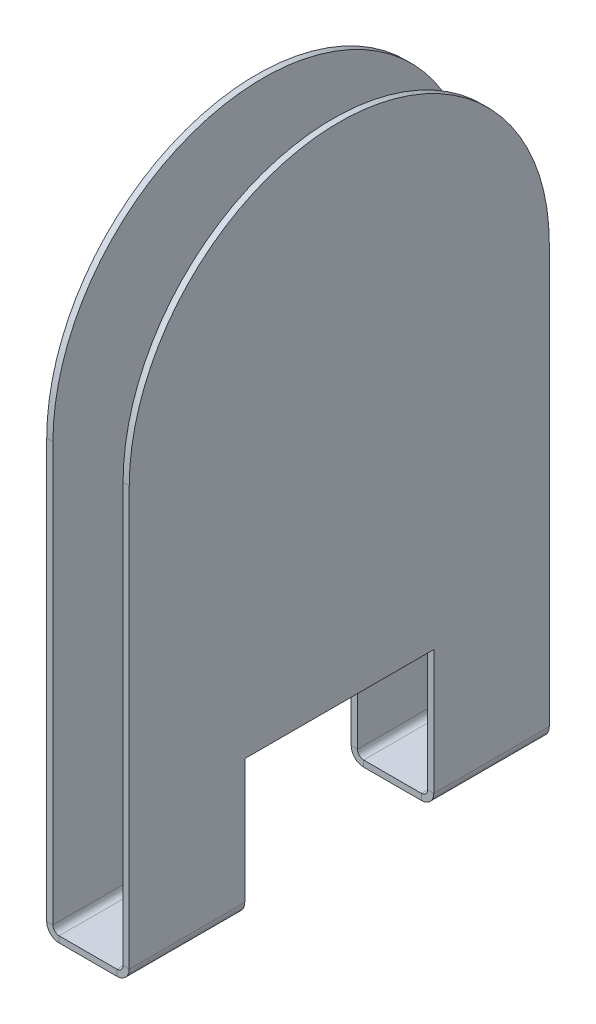
ISO-10303-21;
HEADER;
FILE_DESCRIPTION(('STEP AP214'),'2;1');
FILE_NAME('part.step','',(''),(''),'','','');
FILE_SCHEMA(('AUTOMOTIVE_DESIGN { 1 0 10303 214 1 1 1 1 }'));
ENDSEC;
DATA;
#1=APPLICATION_CONTEXT('core data for automotive mechanical design processes');
#2=APPLICATION_PROTOCOL_DEFINITION('international standard','automotive_design',2000,#1);
#3=PRODUCT_CONTEXT('',#1,'mechanical');
#4=PRODUCT('Part','Part','',(#3));
#5=PRODUCT_RELATED_PRODUCT_CATEGORY('part','',(#4));
#6=PRODUCT_DEFINITION_FORMATION('','',#4);
#7=PRODUCT_DEFINITION_CONTEXT('part definition',#1,'design');
#8=PRODUCT_DEFINITION('design','',#6,#7);
#9=PRODUCT_DEFINITION_SHAPE('','',#8);
#10=(LENGTH_UNIT() NAMED_UNIT(*) SI_UNIT(.MILLI.,.METRE.));
#11=(NAMED_UNIT(*) PLANE_ANGLE_UNIT() SI_UNIT($,.RADIAN.));
#12=(NAMED_UNIT(*) SI_UNIT($,.STERADIAN.) SOLID_ANGLE_UNIT());
#13=UNCERTAINTY_MEASURE_WITH_UNIT(LENGTH_MEASURE(1.E-05),#10,'distance_accuracy_value','');
#14=(GEOMETRIC_REPRESENTATION_CONTEXT(3) GLOBAL_UNCERTAINTY_ASSIGNED_CONTEXT((#13)) GLOBAL_UNIT_ASSIGNED_CONTEXT((#10,
#11,#12)) REPRESENTATION_CONTEXT('',''));
#15=CARTESIAN_POINT('',(0.,0.,0.));
#16=DIRECTION('',(0.,0.,1.));
#17=DIRECTION('',(1.,0.,0.));
#18=AXIS2_PLACEMENT_3D('',#15,#16,#17);
#19=CARTESIAN_POINT('',(35.,-0.7366,11.25));
#20=DIRECTION('',(0.,0.,1.));
#21=DIRECTION('',(1.,0.,0.));
#22=AXIS2_PLACEMENT_3D('',#19,#20,#21);
#23=PLANE('',#22);
#24=DIRECTION('',(1.,0.,0.));
#25=VECTOR('',#24,1.);
#26=CARTESIAN_POINT('',(35.,0.,11.25));
#27=LINE('',#26,#25);
#28=CARTESIAN_POINT('',(51.5616,0.,11.25));
#29=VERTEX_POINT('',#28);
#30=CARTESIAN_POINT('',(58.4384,0.,11.25));
#31=VERTEX_POINT('',#30);
#32=EDGE_CURVE('E68',#29,#31,#27,.T.);
#33=ORIENTED_EDGE('',*,*,#32,.T.);
#34=DIRECTION('',(0.,-1.,0.));
#35=VECTOR('',#34,1.);
#36=CARTESIAN_POINT('',(58.4384,-0.7366,11.25));
#37=LINE('',#36,#35);
#38=CARTESIAN_POINT('',(58.4384,-0.7366,11.25));
#39=VERTEX_POINT('',#38);
#40=EDGE_CURVE('E423',#31,#39,#37,.T.);
#41=ORIENTED_EDGE('',*,*,#40,.T.);
#42=DIRECTION('',(1.,0.,0.));
#43=VECTOR('',#42,1.);
#44=CARTESIAN_POINT('',(35.,-0.7366,11.25));
#45=LINE('',#44,#43);
#46=CARTESIAN_POINT('',(51.5616,-0.7366,11.25));
#47=VERTEX_POINT('',#46);
#48=EDGE_CURVE('E47',#47,#39,#45,.T.);
#49=ORIENTED_EDGE('',*,*,#48,.F.);
#50=DIRECTION('',(0.,-1.,0.));
#51=VECTOR('',#50,1.);
#52=CARTESIAN_POINT('',(51.5616,-0.7366,11.25));
#53=LINE('',#52,#51);
#54=EDGE_CURVE('E407',#29,#47,#53,.T.);
#55=ORIENTED_EDGE('',*,*,#54,.F.);
#56=EDGE_LOOP('',(#33,#41,#49,#55));
#57=FACE_BOUND('',#56,.T.);
#58=ADVANCED_FACE('F43',(#57),#23,.F.);
#59=CARTESIAN_POINT('',(35.,-0.7366,-11.25));
#60=DIRECTION('',(0.,0.,-1.));
#61=DIRECTION('',(-1.,0.,0.));
#62=AXIS2_PLACEMENT_3D('',#59,#60,#61);
#63=PLANE('',#62);
#64=DIRECTION('',(-1.,0.,0.));
#65=VECTOR('',#64,1.);
#66=CARTESIAN_POINT('',(35.,-0.7366,-11.25));
#67=LINE('',#66,#65);
#68=CARTESIAN_POINT('',(58.4384,-0.7366,-11.25));
#69=VERTEX_POINT('',#68);
#70=CARTESIAN_POINT('',(51.5616,-0.7366,-11.25));
#71=VERTEX_POINT('',#70);
#72=EDGE_CURVE('E436',#69,#71,#67,.T.);
#73=ORIENTED_EDGE('',*,*,#72,.F.);
#74=DIRECTION('',(0.,1.,0.));
#75=VECTOR('',#74,1.);
#76=CARTESIAN_POINT('',(58.4384,-0.7366,-11.25));
#77=LINE('',#76,#75);
#78=CARTESIAN_POINT('',(58.4384,0.,-11.25));
#79=VERTEX_POINT('',#78);
#80=EDGE_CURVE('E417',#69,#79,#77,.T.);
#81=ORIENTED_EDGE('',*,*,#80,.T.);
#82=DIRECTION('',(-1.,0.,0.));
#83=VECTOR('',#82,1.);
#84=CARTESIAN_POINT('',(35.,0.,-11.25));
#85=LINE('',#84,#83);
#86=CARTESIAN_POINT('',(51.5616,0.,-11.25));
#87=VERTEX_POINT('',#86);
#88=EDGE_CURVE('E427',#79,#87,#85,.T.);
#89=ORIENTED_EDGE('',*,*,#88,.T.);
#90=DIRECTION('',(0.,1.,0.));
#91=VECTOR('',#90,1.);
#92=CARTESIAN_POINT('',(51.5616,-0.7366,-11.25));
#93=LINE('',#92,#91);
#94=EDGE_CURVE('E390',#71,#87,#93,.T.);
#95=ORIENTED_EDGE('',*,*,#94,.F.);
#96=EDGE_LOOP('',(#73,#81,#89,#95));
#97=FACE_BOUND('',#96,.T.);
#98=ADVANCED_FACE('F45',(#97),#63,.F.);
#99=CARTESIAN_POINT('',(0.,-0.7366,0.));
#100=DIRECTION('',(0.,1.,0.));
#101=DIRECTION('',(0.,0.,1.));
#102=AXIS2_PLACEMENT_3D('',#99,#100,#101);
#103=PLANE('',#102);
#104=DIRECTION('',(-1.,0.,0.));
#105=VECTOR('',#104,1.);
#106=CARTESIAN_POINT('',(0.,-0.7366,-25.));
#107=LINE('',#106,#105);
#108=CARTESIAN_POINT('',(58.4384,-0.7366,-25.));
#109=VERTEX_POINT('',#108);
#110=CARTESIAN_POINT('',(51.5616,-0.7366,-25.));
#111=VERTEX_POINT('',#110);
#112=EDGE_CURVE('E391',#109,#111,#107,.T.);
#113=ORIENTED_EDGE('',*,*,#112,.F.);
#114=DIRECTION('',(0.,0.,1.));
#115=VECTOR('',#114,1.);
#116=CARTESIAN_POINT('',(58.4384,-0.7366,0.));
#117=LINE('',#116,#115);
#118=EDGE_CURVE('E410',#109,#69,#117,.T.);
#119=ORIENTED_EDGE('',*,*,#118,.T.);
#120=ORIENTED_EDGE('',*,*,#72,.T.);
#121=DIRECTION('',(0.,0.,1.));
#122=VECTOR('',#121,1.);
#123=CARTESIAN_POINT('',(51.5616,-0.7366,0.));
#124=LINE('',#123,#122);
#125=EDGE_CURVE('E388',#111,#71,#124,.T.);
#126=ORIENTED_EDGE('',*,*,#125,.F.);
#127=EDGE_LOOP('',(#113,#119,#120,#126));
#128=FACE_BOUND('',#127,.T.);
#129=ADVANCED_FACE('F549',(#128),#103,.F.);
#130=ORIENTED_EDGE('',*,*,#48,.T.);
#131=DIRECTION('',(0.,0.,1.));
#132=VECTOR('',#131,1.);
#133=CARTESIAN_POINT('',(58.4384,-0.7366,0.));
#134=LINE('',#133,#132);
#135=CARTESIAN_POINT('',(58.4384,-0.7366,25.));
#136=VERTEX_POINT('',#135);
#137=EDGE_CURVE('E420',#39,#136,#134,.T.);
#138=ORIENTED_EDGE('',*,*,#137,.T.);
#139=DIRECTION('',(1.,0.,0.));
#140=VECTOR('',#139,1.);
#141=CARTESIAN_POINT('',(0.,-0.7366,25.));
#142=LINE('',#141,#140);
#143=CARTESIAN_POINT('',(51.5616,-0.7366,25.));
#144=VERTEX_POINT('',#143);
#145=EDGE_CURVE('E432',#144,#136,#142,.T.);
#146=ORIENTED_EDGE('',*,*,#145,.F.);
#147=DIRECTION('',(0.,0.,1.));
#148=VECTOR('',#147,1.);
#149=CARTESIAN_POINT('',(51.5616,-0.7366,0.));
#150=LINE('',#149,#148);
#151=EDGE_CURVE('E399',#47,#144,#150,.T.);
#152=ORIENTED_EDGE('',*,*,#151,.F.);
#153=EDGE_LOOP('',(#130,#138,#146,#152));
#154=FACE_BOUND('',#153,.T.);
#155=ADVANCED_FACE('F446',(#154),#103,.F.);
#156=CARTESIAN_POINT('',(0.,0.,0.));
#157=DIRECTION('',(0.,1.,0.));
#158=DIRECTION('',(0.,0.,1.));
#159=AXIS2_PLACEMENT_3D('',#156,#157,#158);
#160=PLANE('',#159);
#161=DIRECTION('',(0.,0.,1.));
#162=VECTOR('',#161,1.);
#163=CARTESIAN_POINT('',(58.4384,0.,0.));
#164=LINE('',#163,#162);
#165=CARTESIAN_POINT('',(58.4384,0.,-25.));
#166=VERTEX_POINT('',#165);
#167=EDGE_CURVE('E415',#166,#79,#164,.T.);
#168=ORIENTED_EDGE('',*,*,#167,.F.);
#169=DIRECTION('',(-1.,0.,0.));
#170=VECTOR('',#169,1.);
#171=CARTESIAN_POINT('',(0.,0.,-25.));
#172=LINE('',#171,#170);
#173=CARTESIAN_POINT('',(51.5616,0.,-25.));
#174=VERTEX_POINT('',#173);
#175=EDGE_CURVE('E434',#166,#174,#172,.T.);
#176=ORIENTED_EDGE('',*,*,#175,.T.);
#177=DIRECTION('',(0.,0.,1.));
#178=VECTOR('',#177,1.);
#179=CARTESIAN_POINT('',(51.5616,0.,0.));
#180=LINE('',#179,#178);
#181=EDGE_CURVE('E393',#174,#87,#180,.T.);
#182=ORIENTED_EDGE('',*,*,#181,.T.);
#183=ORIENTED_EDGE('',*,*,#88,.F.);
#184=EDGE_LOOP('',(#168,#176,#182,#183));
#185=FACE_BOUND('',#184,.T.);
#186=ADVANCED_FACE('F516',(#185),#160,.T.);
#187=DIRECTION('',(0.,0.,1.));
#188=VECTOR('',#187,1.);
#189=CARTESIAN_POINT('',(58.4384,0.,0.));
#190=LINE('',#189,#188);
#191=CARTESIAN_POINT('',(58.4384,0.,25.));
#192=VERTEX_POINT('',#191);
#193=EDGE_CURVE('E52',#31,#192,#190,.T.);
#194=ORIENTED_EDGE('',*,*,#193,.F.);
#195=ORIENTED_EDGE('',*,*,#32,.F.);
#196=DIRECTION('',(0.,0.,1.));
#197=VECTOR('',#196,1.);
#198=CARTESIAN_POINT('',(51.5616,0.,0.));
#199=LINE('',#198,#197);
#200=CARTESIAN_POINT('',(51.5616,0.,25.));
#201=VERTEX_POINT('',#200);
#202=EDGE_CURVE('E405',#29,#201,#199,.T.);
#203=ORIENTED_EDGE('',*,*,#202,.T.);
#204=DIRECTION('',(1.,0.,0.));
#205=VECTOR('',#204,1.);
#206=CARTESIAN_POINT('',(0.,0.,25.));
#207=LINE('',#206,#205);
#208=EDGE_CURVE('E60',#201,#192,#207,.T.);
#209=ORIENTED_EDGE('',*,*,#208,.T.);
#210=EDGE_LOOP('',(#194,#195,#203,#209));
#211=FACE_BOUND('',#210,.T.);
#212=ADVANCED_FACE('F553',(#211),#160,.T.);
#213=CARTESIAN_POINT('',(0.,-0.7366,25.));
#214=DIRECTION('',(0.,0.,1.));
#215=DIRECTION('',(1.,0.,0.));
#216=AXIS2_PLACEMENT_3D('',#213,#214,#215);
#217=PLANE('',#216);
#218=DIRECTION('',(0.,-1.,0.));
#219=VECTOR('',#218,1.);
#220=CARTESIAN_POINT('',(58.4384,-0.7366,25.));
#221=LINE('',#220,#219);
#222=EDGE_CURVE('E12',#192,#136,#221,.T.);
#223=ORIENTED_EDGE('',*,*,#222,.F.);
#224=ORIENTED_EDGE('',*,*,#208,.F.);
#225=DIRECTION('',(0.,-1.,0.));
#226=VECTOR('',#225,1.);
#227=CARTESIAN_POINT('',(51.5616,-0.7366,25.));
#228=LINE('',#227,#226);
#229=EDGE_CURVE('E402',#201,#144,#228,.T.);
#230=ORIENTED_EDGE('',*,*,#229,.T.);
#231=ORIENTED_EDGE('',*,*,#145,.T.);
#232=EDGE_LOOP('',(#223,#224,#230,#231));
#233=FACE_BOUND('',#232,.T.);
#234=ADVANCED_FACE('F462',(#233),#217,.T.);
#235=CARTESIAN_POINT('',(0.,-0.7366,-25.));
#236=DIRECTION('',(0.,0.,-1.));
#237=DIRECTION('',(-1.,0.,0.));
#238=AXIS2_PLACEMENT_3D('',#235,#236,#237);
#239=PLANE('',#238);
#240=DIRECTION('',(0.,1.,0.));
#241=VECTOR('',#240,1.);
#242=CARTESIAN_POINT('',(58.4384,-0.7366,-25.));
#243=LINE('',#242,#241);
#244=EDGE_CURVE('E413',#109,#166,#243,.T.);
#245=ORIENTED_EDGE('',*,*,#244,.F.);
#246=ORIENTED_EDGE('',*,*,#112,.T.);
#247=DIRECTION('',(0.,1.,0.));
#248=VECTOR('',#247,1.);
#249=CARTESIAN_POINT('',(51.5616,-0.7366,-25.));
#250=LINE('',#249,#248);
#251=EDGE_CURVE('E396',#111,#174,#250,.T.);
#252=ORIENTED_EDGE('',*,*,#251,.T.);
#253=ORIENTED_EDGE('',*,*,#175,.F.);
#254=EDGE_LOOP('',(#245,#246,#252,#253));
#255=FACE_BOUND('',#254,.T.);
#256=ADVANCED_FACE('F520',(#255),#239,.T.);
#257=CARTESIAN_POINT('',(51.5616,0.7366,-25.));
#258=DIRECTION('',(0.,0.,-1.));
#259=DIRECTION('',(-1.,0.,0.));
#260=AXIS2_PLACEMENT_3D('',#257,#258,#259);
#261=PLANE('',#260);
#262=DIRECTION('',(1.,0.,0.));
#263=VECTOR('',#262,1.);
#264=CARTESIAN_POINT('',(50.0884,0.736600000000004,-25.));
#265=LINE('',#264,#263);
#266=CARTESIAN_POINT('',(50.0884,0.736600000000008,-25.));
#267=VERTEX_POINT('',#266);
#268=CARTESIAN_POINT('',(50.825,0.736600000000004,-25.));
#269=VERTEX_POINT('',#268);
#270=EDGE_CURVE('E300',#267,#269,#265,.T.);
#271=ORIENTED_EDGE('',*,*,#270,.T.);
#272=CARTESIAN_POINT('',(51.5616,0.7366,-25.));
#273=DIRECTION('',(0.,0.,-1.));
#274=DIRECTION('',(-1.,0.,0.));
#275=AXIS2_PLACEMENT_3D('',#272,#273,#274);
#276=CIRCLE('',#275,0.7366);
#277=EDGE_CURVE('E373',#269,#174,#276,.F.);
#278=ORIENTED_EDGE('',*,*,#277,.T.);
#279=ORIENTED_EDGE('',*,*,#251,.F.);
#280=CARTESIAN_POINT('',(51.5616,0.7366,-25.));
#281=DIRECTION('',(0.,0.,1.));
#282=DIRECTION('',(-1.,0.,0.));
#283=AXIS2_PLACEMENT_3D('',#280,#281,#282);
#284=CIRCLE('',#283,1.4732);
#285=EDGE_CURVE('E378',#267,#111,#284,.T.);
#286=ORIENTED_EDGE('',*,*,#285,.F.);
#287=EDGE_LOOP('',(#271,#278,#279,#286));
#288=FACE_BOUND('',#287,.T.);
#289=ADVANCED_FACE('F524',(#288),#261,.T.);
#290=CARTESIAN_POINT('',(51.5616,0.7366,-11.25));
#291=DIRECTION('',(0.,0.,1.));
#292=DIRECTION('',(1.,0.,0.));
#293=AXIS2_PLACEMENT_3D('',#290,#291,#292);
#294=PLANE('',#293);
#295=CARTESIAN_POINT('',(51.5616,0.7366,-11.25));
#296=DIRECTION('',(0.,0.,-1.));
#297=DIRECTION('',(-1.,0.,0.));
#298=AXIS2_PLACEMENT_3D('',#295,#296,#297);
#299=CIRCLE('',#298,0.7366);
#300=CARTESIAN_POINT('',(50.825,0.736600000000004,-11.25));
#301=VERTEX_POINT('',#300);
#302=EDGE_CURVE('E382',#87,#301,#299,.T.);
#303=ORIENTED_EDGE('',*,*,#302,.T.);
#304=DIRECTION('',(1.,0.,0.));
#305=VECTOR('',#304,1.);
#306=CARTESIAN_POINT('',(50.0884,0.736600000000004,-11.25));
#307=LINE('',#306,#305);
#308=CARTESIAN_POINT('',(50.0884,0.736600000000004,-11.25));
#309=VERTEX_POINT('',#308);
#310=EDGE_CURVE('E313',#309,#301,#307,.T.);
#311=ORIENTED_EDGE('',*,*,#310,.F.);
#312=CARTESIAN_POINT('',(51.5616,0.7366,-11.25));
#313=DIRECTION('',(0.,0.,-1.));
#314=DIRECTION('',(-1.,0.,0.));
#315=AXIS2_PLACEMENT_3D('',#312,#313,#314);
#316=CIRCLE('',#315,1.4732);
#317=EDGE_CURVE('E381',#71,#309,#316,.T.);
#318=ORIENTED_EDGE('',*,*,#317,.F.);
#319=ORIENTED_EDGE('',*,*,#94,.T.);
#320=EDGE_LOOP('',(#303,#311,#318,#319));
#321=FACE_BOUND('',#320,.T.);
#322=ADVANCED_FACE('F511',(#321),#294,.T.);
#323=CARTESIAN_POINT('',(51.5616,0.7366,-4.24633678204233));
#324=DIRECTION('',(0.,0.,-1.));
#325=DIRECTION('',(-1.,0.,0.));
#326=AXIS2_PLACEMENT_3D('',#323,#324,#325);
#327=CYLINDRICAL_SURFACE('',#326,1.4732);
#328=ORIENTED_EDGE('',*,*,#125,.T.);
#329=ORIENTED_EDGE('',*,*,#317,.T.);
#330=DIRECTION('',(0.,0.,1.));
#331=VECTOR('',#330,1.);
#332=CARTESIAN_POINT('',(50.0884,0.736600000000004,0.));
#333=LINE('',#332,#331);
#334=EDGE_CURVE('E343',#267,#309,#333,.T.);
#335=ORIENTED_EDGE('',*,*,#334,.F.);
#336=ORIENTED_EDGE('',*,*,#285,.T.);
#337=EDGE_LOOP('',(#328,#329,#335,#336));
#338=FACE_BOUND('',#337,.T.);
#339=ADVANCED_FACE('F527',(#338),#327,.T.);
#340=CARTESIAN_POINT('',(51.5616,0.7366,-4.24633678204233));
#341=DIRECTION('',(0.,0.,-1.));
#342=DIRECTION('',(-1.,0.,0.));
#343=AXIS2_PLACEMENT_3D('',#340,#341,#342);
#344=CYLINDRICAL_SURFACE('',#343,0.7366);
#345=ORIENTED_EDGE('',*,*,#181,.F.);
#346=ORIENTED_EDGE('',*,*,#277,.F.);
#347=DIRECTION('',(0.,0.,1.));
#348=VECTOR('',#347,1.);
#349=CARTESIAN_POINT('',(50.825,0.736600000000004,0.));
#350=LINE('',#349,#348);
#351=EDGE_CURVE('E361',#269,#301,#350,.T.);
#352=ORIENTED_EDGE('',*,*,#351,.T.);
#353=ORIENTED_EDGE('',*,*,#302,.F.);
#354=EDGE_LOOP('',(#345,#346,#352,#353));
#355=FACE_BOUND('',#354,.T.);
#356=ADVANCED_FACE('F510',(#355),#344,.F.);
#357=CARTESIAN_POINT('',(51.5616,0.7366,11.25));
#358=DIRECTION('',(0.,0.,-1.));
#359=DIRECTION('',(-1.,0.,0.));
#360=AXIS2_PLACEMENT_3D('',#357,#358,#359);
#361=PLANE('',#360);
#362=DIRECTION('',(-1.,0.,0.));
#363=VECTOR('',#362,1.);
#364=CARTESIAN_POINT('',(50.0884,0.736600000000004,11.25));
#365=LINE('',#364,#363);
#366=CARTESIAN_POINT('',(50.825,0.736600000000004,11.25));
#367=VERTEX_POINT('',#366);
#368=CARTESIAN_POINT('',(50.0884,0.736600000000008,11.25));
#369=VERTEX_POINT('',#368);
#370=EDGE_CURVE('E319',#367,#369,#365,.T.);
#371=ORIENTED_EDGE('',*,*,#370,.F.);
#372=CARTESIAN_POINT('',(51.5616,0.7366,11.25));
#373=DIRECTION('',(0.,0.,-1.));
#374=DIRECTION('',(-1.,0.,0.));
#375=AXIS2_PLACEMENT_3D('',#372,#373,#374);
#376=CIRCLE('',#375,0.7366);
#377=EDGE_CURVE('E308',#367,#29,#376,.F.);
#378=ORIENTED_EDGE('',*,*,#377,.T.);
#379=ORIENTED_EDGE('',*,*,#54,.T.);
#380=CARTESIAN_POINT('',(51.5616,0.7366,11.25));
#381=DIRECTION('',(0.,0.,1.));
#382=DIRECTION('',(1.,0.,0.));
#383=AXIS2_PLACEMENT_3D('',#380,#381,#382);
#384=CIRCLE('',#383,1.4732);
#385=EDGE_CURVE('E366',#369,#47,#384,.T.);
#386=ORIENTED_EDGE('',*,*,#385,.F.);
#387=EDGE_LOOP('',(#371,#378,#379,#386));
#388=FACE_BOUND('',#387,.T.);
#389=ADVANCED_FACE('F489',(#388),#361,.T.);
#390=CARTESIAN_POINT('',(51.5616,0.7366,25.));
#391=DIRECTION('',(0.,0.,1.));
#392=DIRECTION('',(1.,0.,0.));
#393=AXIS2_PLACEMENT_3D('',#390,#391,#392);
#394=PLANE('',#393);
#395=CARTESIAN_POINT('',(51.5616,0.7366,25.));
#396=DIRECTION('',(0.,0.,-1.));
#397=DIRECTION('',(-1.,0.,0.));
#398=AXIS2_PLACEMENT_3D('',#395,#396,#397);
#399=CIRCLE('',#398,0.7366);
#400=CARTESIAN_POINT('',(50.825,0.736600000000004,25.));
#401=VERTEX_POINT('',#400);
#402=EDGE_CURVE('E370',#201,#401,#399,.T.);
#403=ORIENTED_EDGE('',*,*,#402,.T.);
#404=DIRECTION('',(-1.,0.,0.));
#405=VECTOR('',#404,1.);
#406=CARTESIAN_POINT('',(50.0884,0.736600000000004,25.));
#407=LINE('',#406,#405);
#408=CARTESIAN_POINT('',(50.0884,0.736600000000004,25.));
#409=VERTEX_POINT('',#408);
#410=EDGE_CURVE('E355',#401,#409,#407,.T.);
#411=ORIENTED_EDGE('',*,*,#410,.T.);
#412=CARTESIAN_POINT('',(51.5616,0.7366,25.));
#413=DIRECTION('',(0.,0.,-1.));
#414=DIRECTION('',(1.,0.,0.));
#415=AXIS2_PLACEMENT_3D('',#412,#413,#414);
#416=CIRCLE('',#415,1.4732);
#417=EDGE_CURVE('E369',#144,#409,#416,.T.);
#418=ORIENTED_EDGE('',*,*,#417,.F.);
#419=ORIENTED_EDGE('',*,*,#229,.F.);
#420=EDGE_LOOP('',(#403,#411,#418,#419));
#421=FACE_BOUND('',#420,.T.);
#422=ADVANCED_FACE('F471',(#421),#394,.T.);
#423=CARTESIAN_POINT('',(51.5616,0.7366,32.0036632179577));
#424=DIRECTION('',(0.,0.,-1.));
#425=DIRECTION('',(-1.,0.,0.));
#426=AXIS2_PLACEMENT_3D('',#423,#424,#425);
#427=CYLINDRICAL_SURFACE('',#426,1.4732);
#428=ORIENTED_EDGE('',*,*,#151,.T.);
#429=ORIENTED_EDGE('',*,*,#417,.T.);
#430=DIRECTION('',(0.,0.,1.));
#431=VECTOR('',#430,1.);
#432=CARTESIAN_POINT('',(50.0884,0.736600000000004,0.));
#433=LINE('',#432,#431);
#434=EDGE_CURVE('E333',#369,#409,#433,.T.);
#435=ORIENTED_EDGE('',*,*,#434,.F.);
#436=ORIENTED_EDGE('',*,*,#385,.T.);
#437=EDGE_LOOP('',(#428,#429,#435,#436));
#438=FACE_BOUND('',#437,.T.);
#439=ADVANCED_FACE('F468',(#438),#427,.T.);
#440=CARTESIAN_POINT('',(51.5616,0.7366,32.0036632179577));
#441=DIRECTION('',(0.,0.,-1.));
#442=DIRECTION('',(-1.,0.,0.));
#443=AXIS2_PLACEMENT_3D('',#440,#441,#442);
#444=CYLINDRICAL_SURFACE('',#443,0.7366);
#445=ORIENTED_EDGE('',*,*,#202,.F.);
#446=ORIENTED_EDGE('',*,*,#377,.F.);
#447=DIRECTION('',(0.,0.,1.));
#448=VECTOR('',#447,1.);
#449=CARTESIAN_POINT('',(50.825,0.736600000000004,0.));
#450=LINE('',#449,#448);
#451=EDGE_CURVE('E358',#367,#401,#450,.T.);
#452=ORIENTED_EDGE('',*,*,#451,.T.);
#453=ORIENTED_EDGE('',*,*,#402,.F.);
#454=EDGE_LOOP('',(#445,#446,#452,#453));
#455=FACE_BOUND('',#454,.T.);
#456=ADVANCED_FACE('F481',(#455),#444,.F.);
#457=CARTESIAN_POINT('',(50.0884000000002,50.5626271385243,0.));
#458=DIRECTION('',(1.,0.,0.));
#459=DIRECTION('',(0.,0.,1.));
#460=AXIS2_PLACEMENT_3D('',#457,#458,#459);
#461=CYLINDRICAL_SURFACE('',#460,25.);
#462=CARTESIAN_POINT('',(50.8250000000002,50.5626271385243,0.));
#463=DIRECTION('',(1.,0.,0.));
#464=DIRECTION('',(0.,0.,1.));
#465=AXIS2_PLACEMENT_3D('',#462,#463,#464);
#466=CIRCLE('',#465,25.);
#467=CARTESIAN_POINT('',(50.8250000000002,50.5626271385243,-25.));
#468=VERTEX_POINT('',#467);
#469=CARTESIAN_POINT('',(50.8250000000002,50.5626271385243,25.));
#470=VERTEX_POINT('',#469);
#471=EDGE_CURVE('E325',#468,#470,#466,.T.);
#472=ORIENTED_EDGE('',*,*,#471,.F.);
#473=DIRECTION('',(1.,0.,0.));
#474=VECTOR('',#473,1.);
#475=CARTESIAN_POINT('',(50.0884000000002,50.5626271385243,-25.));
#476=LINE('',#475,#474);
#477=CARTESIAN_POINT('',(50.0884000000002,50.5626271385243,-25.));
#478=VERTEX_POINT('',#477);
#479=EDGE_CURVE('E305',#478,#468,#476,.T.);
#480=ORIENTED_EDGE('',*,*,#479,.F.);
#481=CARTESIAN_POINT('',(50.0884000000002,50.5626271385243,0.));
#482=DIRECTION('',(1.,0.,0.));
#483=DIRECTION('',(0.,0.,1.));
#484=AXIS2_PLACEMENT_3D('',#481,#482,#483);
#485=CIRCLE('',#484,25.);
#486=CARTESIAN_POINT('',(50.0884000000002,50.5626271385243,25.));
#487=VERTEX_POINT('',#486);
#488=EDGE_CURVE('E352',#478,#487,#485,.T.);
#489=ORIENTED_EDGE('',*,*,#488,.T.);
#490=DIRECTION('',(1.,0.,0.));
#491=VECTOR('',#490,1.);
#492=CARTESIAN_POINT('',(50.0884000000002,50.5626271385243,25.));
#493=LINE('',#492,#491);
#494=EDGE_CURVE('E350',#487,#470,#493,.T.);
#495=ORIENTED_EDGE('',*,*,#494,.T.);
#496=EDGE_LOOP('',(#472,#480,#489,#495));
#497=FACE_BOUND('',#496,.T.);
#498=ADVANCED_FACE('F534',(#497),#461,.T.);
#499=CARTESIAN_POINT('',(50.0884000000001,15.5626271385243,-11.25));
#500=DIRECTION('',(0.,1.,0.));
#501=DIRECTION('',(0.,0.,1.));
#502=AXIS2_PLACEMENT_3D('',#499,#500,#501);
#503=PLANE('',#502);
#504=DIRECTION('',(0.,0.,1.));
#505=VECTOR('',#504,1.);
#506=CARTESIAN_POINT('',(50.8250000000001,15.5626271385243,-11.25));
#507=LINE('',#506,#505);
#508=CARTESIAN_POINT('',(50.8250000000001,15.5626271385243,-11.25));
#509=VERTEX_POINT('',#508);
#510=CARTESIAN_POINT('',(50.8250000000001,15.5626271385243,11.25));
#511=VERTEX_POINT('',#510);
#512=EDGE_CURVE('E348',#509,#511,#507,.T.);
#513=ORIENTED_EDGE('',*,*,#512,.T.);
#514=DIRECTION('',(1.,0.,0.));
#515=VECTOR('',#514,1.);
#516=CARTESIAN_POINT('',(50.0884000000001,15.5626271385243,11.25));
#517=LINE('',#516,#515);
#518=CARTESIAN_POINT('',(50.0884000000001,15.5626271385243,11.25));
#519=VERTEX_POINT('',#518);
#520=EDGE_CURVE('E316',#519,#511,#517,.T.);
#521=ORIENTED_EDGE('',*,*,#520,.F.);
#522=DIRECTION('',(0.,0.,1.));
#523=VECTOR('',#522,1.);
#524=CARTESIAN_POINT('',(50.0884000000001,15.5626271385243,-11.25));
#525=LINE('',#524,#523);
#526=CARTESIAN_POINT('',(50.0884000000001,15.5626271385243,-11.25));
#527=VERTEX_POINT('',#526);
#528=EDGE_CURVE('E338',#527,#519,#525,.T.);
#529=ORIENTED_EDGE('',*,*,#528,.F.);
#530=DIRECTION('',(1.,0.,0.));
#531=VECTOR('',#530,1.);
#532=CARTESIAN_POINT('',(50.0884000000001,15.5626271385243,-11.25));
#533=LINE('',#532,#531);
#534=EDGE_CURVE('E345',#527,#509,#533,.T.);
#535=ORIENTED_EDGE('',*,*,#534,.T.);
#536=EDGE_LOOP('',(#513,#521,#529,#535));
#537=FACE_BOUND('',#536,.T.);
#538=ADVANCED_FACE('F500',(#537),#503,.F.);
#539=CARTESIAN_POINT('',(50.0884000000002,50.5626271385243,0.));
#540=DIRECTION('',(1.,0.,0.));
#541=DIRECTION('',(0.,0.,1.));
#542=AXIS2_PLACEMENT_3D('',#539,#540,#541);
#543=PLANE('',#542);
#544=DIRECTION('',(0.,1.,0.));
#545=VECTOR('',#544,1.);
#546=CARTESIAN_POINT('',(50.0884000000002,50.5626271385243,-25.));
#547=LINE('',#546,#545);
#548=EDGE_CURVE('E309',#267,#478,#547,.T.);
#549=ORIENTED_EDGE('',*,*,#548,.F.);
#550=ORIENTED_EDGE('',*,*,#334,.T.);
#551=DIRECTION('',(0.,1.,0.));
#552=VECTOR('',#551,1.);
#553=CARTESIAN_POINT('',(50.0884000000001,15.5626271385243,-11.25));
#554=LINE('',#553,#552);
#555=EDGE_CURVE('E341',#309,#527,#554,.T.);
#556=ORIENTED_EDGE('',*,*,#555,.T.);
#557=ORIENTED_EDGE('',*,*,#528,.T.);
#558=DIRECTION('',(0.,-1.,0.));
#559=VECTOR('',#558,1.);
#560=CARTESIAN_POINT('',(50.0884000000001,15.5626271385243,11.25));
#561=LINE('',#560,#559);
#562=EDGE_CURVE('E335',#519,#369,#561,.T.);
#563=ORIENTED_EDGE('',*,*,#562,.T.);
#564=ORIENTED_EDGE('',*,*,#434,.T.);
#565=DIRECTION('',(0.,-1.,0.));
#566=VECTOR('',#565,1.);
#567=CARTESIAN_POINT('',(50.0884000000002,50.5626271385243,25.));
#568=LINE('',#567,#566);
#569=EDGE_CURVE('E330',#487,#409,#568,.T.);
#570=ORIENTED_EDGE('',*,*,#569,.F.);
#571=ORIENTED_EDGE('',*,*,#488,.F.);
#572=EDGE_LOOP('',(#549,#550,#556,#557,#563,#564,#570,#571));
#573=FACE_BOUND('',#572,.T.);
#574=ADVANCED_FACE('F495',(#573),#543,.F.);
#575=CARTESIAN_POINT('',(50.0884000000002,50.5626271385243,25.));
#576=DIRECTION('',(0.,0.,1.));
#577=DIRECTION('',(0.,-1.,0.));
#578=AXIS2_PLACEMENT_3D('',#575,#576,#577);
#579=PLANE('',#578);
#580=ORIENTED_EDGE('',*,*,#410,.F.);
#581=DIRECTION('',(0.,-1.,0.));
#582=VECTOR('',#581,1.);
#583=CARTESIAN_POINT('',(50.8250000000002,50.5626271385243,25.));
#584=LINE('',#583,#582);
#585=EDGE_CURVE('E323',#470,#401,#584,.T.);
#586=ORIENTED_EDGE('',*,*,#585,.F.);
#587=ORIENTED_EDGE('',*,*,#494,.F.);
#588=ORIENTED_EDGE('',*,*,#569,.T.);
#589=EDGE_LOOP('',(#580,#586,#587,#588));
#590=FACE_BOUND('',#589,.T.);
#591=ADVANCED_FACE('F475',(#590),#579,.T.);
#592=CARTESIAN_POINT('',(50.8250000000002,50.5626271385243,0.));
#593=DIRECTION('',(1.,0.,0.));
#594=DIRECTION('',(0.,0.,1.));
#595=AXIS2_PLACEMENT_3D('',#592,#593,#594);
#596=PLANE('',#595);
#597=ORIENTED_EDGE('',*,*,#351,.F.);
#598=DIRECTION('',(0.,1.,0.));
#599=VECTOR('',#598,1.);
#600=CARTESIAN_POINT('',(50.8250000000002,50.5626271385243,-25.));
#601=LINE('',#600,#599);
#602=EDGE_CURVE('E328',#269,#468,#601,.T.);
#603=ORIENTED_EDGE('',*,*,#602,.T.);
#604=ORIENTED_EDGE('',*,*,#471,.T.);
#605=ORIENTED_EDGE('',*,*,#585,.T.);
#606=ORIENTED_EDGE('',*,*,#451,.F.);
#607=DIRECTION('',(0.,-1.,0.));
#608=VECTOR('',#607,1.);
#609=CARTESIAN_POINT('',(50.8250000000001,15.5626271385243,11.25));
#610=LINE('',#609,#608);
#611=EDGE_CURVE('E321',#511,#367,#610,.T.);
#612=ORIENTED_EDGE('',*,*,#611,.F.);
#613=ORIENTED_EDGE('',*,*,#512,.F.);
#614=DIRECTION('',(0.,1.,0.));
#615=VECTOR('',#614,1.);
#616=CARTESIAN_POINT('',(50.8250000000001,15.5626271385243,-11.25));
#617=LINE('',#616,#615);
#618=EDGE_CURVE('E311',#301,#509,#617,.T.);
#619=ORIENTED_EDGE('',*,*,#618,.F.);
#620=EDGE_LOOP('',(#597,#603,#604,#605,#606,#612,#613,#619));
#621=FACE_BOUND('',#620,.T.);
#622=ADVANCED_FACE('F486',(#621),#596,.T.);
#623=CARTESIAN_POINT('',(50.0884000000001,15.5626271385243,11.25));
#624=DIRECTION('',(0.,0.,1.));
#625=DIRECTION('',(0.,-1.,0.));
#626=AXIS2_PLACEMENT_3D('',#623,#624,#625);
#627=PLANE('',#626);
#628=ORIENTED_EDGE('',*,*,#611,.T.);
#629=ORIENTED_EDGE('',*,*,#370,.T.);
#630=ORIENTED_EDGE('',*,*,#562,.F.);
#631=ORIENTED_EDGE('',*,*,#520,.T.);
#632=EDGE_LOOP('',(#628,#629,#630,#631));
#633=FACE_BOUND('',#632,.T.);
#634=ADVANCED_FACE('F492',(#633),#627,.F.);
#635=CARTESIAN_POINT('',(50.0884000000001,15.5626271385243,-11.25));
#636=DIRECTION('',(0.,0.,-1.));
#637=DIRECTION('',(0.,1.,0.));
#638=AXIS2_PLACEMENT_3D('',#635,#636,#637);
#639=PLANE('',#638);
#640=ORIENTED_EDGE('',*,*,#555,.F.);
#641=ORIENTED_EDGE('',*,*,#310,.T.);
#642=ORIENTED_EDGE('',*,*,#618,.T.);
#643=ORIENTED_EDGE('',*,*,#534,.F.);
#644=EDGE_LOOP('',(#640,#641,#642,#643));
#645=FACE_BOUND('',#644,.T.);
#646=ADVANCED_FACE('F503',(#645),#639,.F.);
#647=CARTESIAN_POINT('',(50.0884000000002,50.5626271385243,-25.));
#648=DIRECTION('',(0.,0.,-1.));
#649=DIRECTION('',(0.,1.,0.));
#650=AXIS2_PLACEMENT_3D('',#647,#648,#649);
#651=PLANE('',#650);
#652=ORIENTED_EDGE('',*,*,#270,.F.);
#653=ORIENTED_EDGE('',*,*,#548,.T.);
#654=ORIENTED_EDGE('',*,*,#479,.T.);
#655=ORIENTED_EDGE('',*,*,#602,.F.);
#656=EDGE_LOOP('',(#652,#653,#654,#655));
#657=FACE_BOUND('',#656,.T.);
#658=ADVANCED_FACE('F531',(#657),#651,.T.);
#659=CARTESIAN_POINT('',(58.4384,0.7366,-25.));
#660=DIRECTION('',(0.,0.,-1.));
#661=DIRECTION('',(-1.,0.,0.));
#662=AXIS2_PLACEMENT_3D('',#659,#660,#661);
#663=PLANE('',#662);
#664=ORIENTED_EDGE('',*,*,#244,.T.);
#665=CARTESIAN_POINT('',(58.4384,0.7366,-25.));
#666=DIRECTION('',(0.,0.,1.));
#667=DIRECTION('',(1.,0.,0.));
#668=AXIS2_PLACEMENT_3D('',#665,#666,#667);
#669=CIRCLE('',#668,0.7366);
#670=CARTESIAN_POINT('',(59.175,0.736600000000004,-25.));
#671=VERTEX_POINT('',#670);
#672=EDGE_CURVE('E290',#166,#671,#669,.T.);
#673=ORIENTED_EDGE('',*,*,#672,.T.);
#674=DIRECTION('',(-1.,0.,0.));
#675=VECTOR('',#674,1.);
#676=CARTESIAN_POINT('',(59.9116,0.736600000000004,-25.));
#677=LINE('',#676,#675);
#678=CARTESIAN_POINT('',(59.9116,0.736600000000004,-25.));
#679=VERTEX_POINT('',#678);
#680=EDGE_CURVE('E217',#679,#671,#677,.T.);
#681=ORIENTED_EDGE('',*,*,#680,.F.);
#682=CARTESIAN_POINT('',(58.4384,0.7366,-25.));
#683=DIRECTION('',(0.,0.,1.));
#684=DIRECTION('',(-1.,0.,0.));
#685=AXIS2_PLACEMENT_3D('',#682,#683,#684);
#686=CIRCLE('',#685,1.4732);
#687=EDGE_CURVE('E293',#109,#679,#686,.T.);
#688=ORIENTED_EDGE('',*,*,#687,.F.);
#689=EDGE_LOOP('',(#664,#673,#681,#688));
#690=FACE_BOUND('',#689,.T.);
#691=ADVANCED_FACE('F578',(#690),#663,.T.);
#692=CARTESIAN_POINT('',(58.4384,0.7366,-11.25));
#693=DIRECTION('',(0.,0.,1.));
#694=DIRECTION('',(1.,0.,0.));
#695=AXIS2_PLACEMENT_3D('',#692,#693,#694);
#696=PLANE('',#695);
#697=DIRECTION('',(-1.,0.,0.));
#698=VECTOR('',#697,1.);
#699=CARTESIAN_POINT('',(59.9116,0.736600000000004,-11.25));
#700=LINE('',#699,#698);
#701=CARTESIAN_POINT('',(59.9116,0.736600000000008,-11.25));
#702=VERTEX_POINT('',#701);
#703=CARTESIAN_POINT('',(59.175,0.736600000000004,-11.25));
#704=VERTEX_POINT('',#703);
#705=EDGE_CURVE('E279',#702,#704,#700,.T.);
#706=ORIENTED_EDGE('',*,*,#705,.T.);
#707=CARTESIAN_POINT('',(58.4384,0.7366,-11.25));
#708=DIRECTION('',(0.,0.,1.));
#709=DIRECTION('',(1.,0.,0.));
#710=AXIS2_PLACEMENT_3D('',#707,#708,#709);
#711=CIRCLE('',#710,0.7366);
#712=EDGE_CURVE('E297',#704,#79,#711,.F.);
#713=ORIENTED_EDGE('',*,*,#712,.T.);
#714=ORIENTED_EDGE('',*,*,#80,.F.);
#715=CARTESIAN_POINT('',(58.4384,0.7366,-11.25));
#716=DIRECTION('',(0.,0.,-1.));
#717=DIRECTION('',(-1.,0.,0.));
#718=AXIS2_PLACEMENT_3D('',#715,#716,#717);
#719=CIRCLE('',#718,1.4732);
#720=EDGE_CURVE('E296',#702,#69,#719,.T.);
#721=ORIENTED_EDGE('',*,*,#720,.F.);
#722=EDGE_LOOP('',(#706,#713,#714,#721));
#723=FACE_BOUND('',#722,.T.);
#724=ADVANCED_FACE('F618',(#723),#696,.T.);
#725=CARTESIAN_POINT('',(58.4384,0.7366,-32.0036632179577));
#726=DIRECTION('',(0.,0.,1.));
#727=DIRECTION('',(1.,0.,0.));
#728=AXIS2_PLACEMENT_3D('',#725,#726,#727);
#729=CYLINDRICAL_SURFACE('',#728,1.4732);
#730=ORIENTED_EDGE('',*,*,#720,.T.);
#731=ORIENTED_EDGE('',*,*,#118,.F.);
#732=ORIENTED_EDGE('',*,*,#687,.T.);
#733=DIRECTION('',(0.,0.,1.));
#734=VECTOR('',#733,1.);
#735=CARTESIAN_POINT('',(59.9116,0.736600000000004,0.));
#736=LINE('',#735,#734);
#737=EDGE_CURVE('E281',#679,#702,#736,.T.);
#738=ORIENTED_EDGE('',*,*,#737,.T.);
#739=EDGE_LOOP('',(#730,#731,#732,#738));
#740=FACE_BOUND('',#739,.T.);
#741=ADVANCED_FACE('F625',(#740),#729,.T.);
#742=CARTESIAN_POINT('',(58.4384,0.7366,-32.0036632179577));
#743=DIRECTION('',(0.,0.,1.));
#744=DIRECTION('',(1.,0.,0.));
#745=AXIS2_PLACEMENT_3D('',#742,#743,#744);
#746=CYLINDRICAL_SURFACE('',#745,0.7366);
#747=ORIENTED_EDGE('',*,*,#712,.F.);
#748=DIRECTION('',(0.,0.,1.));
#749=VECTOR('',#748,1.);
#750=CARTESIAN_POINT('',(59.175,0.736600000000004,0.));
#751=LINE('',#750,#749);
#752=EDGE_CURVE('E230',#671,#704,#751,.T.);
#753=ORIENTED_EDGE('',*,*,#752,.F.);
#754=ORIENTED_EDGE('',*,*,#672,.F.);
#755=ORIENTED_EDGE('',*,*,#167,.T.);
#756=EDGE_LOOP('',(#747,#753,#754,#755));
#757=FACE_BOUND('',#756,.T.);
#758=ADVANCED_FACE('F633',(#757),#746,.F.);
#759=CARTESIAN_POINT('',(58.4384,0.7366,11.25));
#760=DIRECTION('',(0.,0.,-1.));
#761=DIRECTION('',(-1.,0.,0.));
#762=AXIS2_PLACEMENT_3D('',#759,#760,#761);
#763=PLANE('',#762);
#764=ORIENTED_EDGE('',*,*,#40,.F.);
#765=CARTESIAN_POINT('',(58.4384,0.7366,11.25));
#766=DIRECTION('',(0.,0.,1.));
#767=DIRECTION('',(1.,0.,0.));
#768=AXIS2_PLACEMENT_3D('',#765,#766,#767);
#769=CIRCLE('',#768,0.7366);
#770=CARTESIAN_POINT('',(59.175,0.736600000000004,11.25));
#771=VERTEX_POINT('',#770);
#772=EDGE_CURVE('E232',#31,#771,#769,.T.);
#773=ORIENTED_EDGE('',*,*,#772,.T.);
#774=DIRECTION('',(1.,0.,0.));
#775=VECTOR('',#774,1.);
#776=CARTESIAN_POINT('',(59.9116,0.736600000000004,11.25));
#777=LINE('',#776,#775);
#778=CARTESIAN_POINT('',(59.9116,0.736600000000004,11.25));
#779=VERTEX_POINT('',#778);
#780=EDGE_CURVE('E226',#771,#779,#777,.T.);
#781=ORIENTED_EDGE('',*,*,#780,.T.);
#782=CARTESIAN_POINT('',(58.4384,0.7366,11.25));
#783=DIRECTION('',(0.,0.,1.));
#784=DIRECTION('',(1.,0.,0.));
#785=AXIS2_PLACEMENT_3D('',#782,#783,#784);
#786=CIRCLE('',#785,1.4732);
#787=EDGE_CURVE('E284',#39,#779,#786,.T.);
#788=ORIENTED_EDGE('',*,*,#787,.F.);
#789=EDGE_LOOP('',(#764,#773,#781,#788));
#790=FACE_BOUND('',#789,.T.);
#791=ADVANCED_FACE('F452',(#790),#763,.T.);
#792=CARTESIAN_POINT('',(58.4384,0.7366,25.));
#793=DIRECTION('',(0.,0.,1.));
#794=DIRECTION('',(1.,0.,0.));
#795=AXIS2_PLACEMENT_3D('',#792,#793,#794);
#796=PLANE('',#795);
#797=DIRECTION('',(1.,0.,0.));
#798=VECTOR('',#797,1.);
#799=CARTESIAN_POINT('',(59.9116,0.736600000000004,25.));
#800=LINE('',#799,#798);
#801=CARTESIAN_POINT('',(59.175,0.736600000000004,25.));
#802=VERTEX_POINT('',#801);
#803=CARTESIAN_POINT('',(59.9116,0.736600000000008,25.));
#804=VERTEX_POINT('',#803);
#805=EDGE_CURVE('E248',#802,#804,#800,.T.);
#806=ORIENTED_EDGE('',*,*,#805,.F.);
#807=CARTESIAN_POINT('',(58.4384,0.7366,25.));
#808=DIRECTION('',(0.,0.,1.));
#809=DIRECTION('',(1.,0.,0.));
#810=AXIS2_PLACEMENT_3D('',#807,#808,#809);
#811=CIRCLE('',#810,0.7366);
#812=EDGE_CURVE('E235',#802,#192,#811,.F.);
#813=ORIENTED_EDGE('',*,*,#812,.T.);
#814=ORIENTED_EDGE('',*,*,#222,.T.);
#815=CARTESIAN_POINT('',(58.4384,0.7366,25.));
#816=DIRECTION('',(0.,0.,-1.));
#817=DIRECTION('',(1.,0.,0.));
#818=AXIS2_PLACEMENT_3D('',#815,#816,#817);
#819=CIRCLE('',#818,1.4732);
#820=EDGE_CURVE('E287',#804,#136,#819,.T.);
#821=ORIENTED_EDGE('',*,*,#820,.F.);
#822=EDGE_LOOP('',(#806,#813,#814,#821));
#823=FACE_BOUND('',#822,.T.);
#824=ADVANCED_FACE('F459',(#823),#796,.T.);
#825=CARTESIAN_POINT('',(58.4384,0.7366,4.24633678204234));
#826=DIRECTION('',(0.,0.,1.));
#827=DIRECTION('',(1.,0.,0.));
#828=AXIS2_PLACEMENT_3D('',#825,#826,#827);
#829=CYLINDRICAL_SURFACE('',#828,1.4732);
#830=ORIENTED_EDGE('',*,*,#820,.T.);
#831=ORIENTED_EDGE('',*,*,#137,.F.);
#832=ORIENTED_EDGE('',*,*,#787,.T.);
#833=DIRECTION('',(0.,0.,1.));
#834=VECTOR('',#833,1.);
#835=CARTESIAN_POINT('',(59.9116,0.736600000000004,0.));
#836=LINE('',#835,#834);
#837=EDGE_CURVE('E276',#779,#804,#836,.T.);
#838=ORIENTED_EDGE('',*,*,#837,.T.);
#839=EDGE_LOOP('',(#830,#831,#832,#838));
#840=FACE_BOUND('',#839,.T.);
#841=ADVANCED_FACE('F455',(#840),#829,.T.);
#842=CARTESIAN_POINT('',(58.4384,0.7366,4.24633678204234));
#843=DIRECTION('',(0.,0.,1.));
#844=DIRECTION('',(1.,0.,0.));
#845=AXIS2_PLACEMENT_3D('',#842,#843,#844);
#846=CYLINDRICAL_SURFACE('',#845,0.7366);
#847=ORIENTED_EDGE('',*,*,#812,.F.);
#848=DIRECTION('',(0.,0.,1.));
#849=VECTOR('',#848,1.);
#850=CARTESIAN_POINT('',(59.175,0.736600000000004,0.));
#851=LINE('',#850,#849);
#852=EDGE_CURVE('E255',#771,#802,#851,.T.);
#853=ORIENTED_EDGE('',*,*,#852,.F.);
#854=ORIENTED_EDGE('',*,*,#772,.F.);
#855=ORIENTED_EDGE('',*,*,#193,.T.);
#856=EDGE_LOOP('',(#847,#853,#854,#855));
#857=FACE_BOUND('',#856,.T.);
#858=ADVANCED_FACE('F660',(#857),#846,.F.);
#859=CARTESIAN_POINT('',(59.9116,15.5626271385243,-11.25));
#860=DIRECTION('',(0.,1.,0.));
#861=DIRECTION('',(0.,0.,-1.));
#862=AXIS2_PLACEMENT_3D('',#859,#860,#861);
#863=PLANE('',#862);
#864=DIRECTION('',(0.,0.,-1.));
#865=VECTOR('',#864,1.);
#866=CARTESIAN_POINT('',(59.175,15.5626271385243,-11.25));
#867=LINE('',#866,#865);
#868=CARTESIAN_POINT('',(59.175,15.5626271385243,11.25));
#869=VERTEX_POINT('',#868);
#870=CARTESIAN_POINT('',(59.175,15.5626271385243,-11.25));
#871=VERTEX_POINT('',#870);
#872=EDGE_CURVE('E221',#869,#871,#867,.T.);
#873=ORIENTED_EDGE('',*,*,#872,.T.);
#874=DIRECTION('',(-1.,0.,0.));
#875=VECTOR('',#874,1.);
#876=CARTESIAN_POINT('',(59.9116,15.5626271385243,-11.25));
#877=LINE('',#876,#875);
#878=CARTESIAN_POINT('',(59.9116,15.5626271385243,-11.25));
#879=VERTEX_POINT('',#878);
#880=EDGE_CURVE('E206',#879,#871,#877,.T.);
#881=ORIENTED_EDGE('',*,*,#880,.F.);
#882=DIRECTION('',(0.,0.,-1.));
#883=VECTOR('',#882,1.);
#884=CARTESIAN_POINT('',(59.9116,15.5626271385243,-11.25));
#885=LINE('',#884,#883);
#886=CARTESIAN_POINT('',(59.9116,15.5626271385243,11.25));
#887=VERTEX_POINT('',#886);
#888=EDGE_CURVE('E264',#887,#879,#885,.T.);
#889=ORIENTED_EDGE('',*,*,#888,.F.);
#890=DIRECTION('',(-1.,0.,0.));
#891=VECTOR('',#890,1.);
#892=CARTESIAN_POINT('',(59.9116,15.5626271385243,11.25));
#893=LINE('',#892,#891);
#894=EDGE_CURVE('E224',#887,#869,#893,.T.);
#895=ORIENTED_EDGE('',*,*,#894,.T.);
#896=EDGE_LOOP('',(#873,#881,#889,#895));
#897=FACE_BOUND('',#896,.T.);
#898=ADVANCED_FACE('F222',(#897),#863,.F.);
#899=CARTESIAN_POINT('',(59.9115999999998,50.5626271385243,0.));
#900=DIRECTION('',(-1.,0.,0.));
#901=DIRECTION('',(0.,0.,1.));
#902=AXIS2_PLACEMENT_3D('',#899,#900,#901);
#903=CYLINDRICAL_SURFACE('',#902,25.);
#904=CARTESIAN_POINT('',(59.1749999999998,50.5626271385243,0.));
#905=DIRECTION('',(-1.,0.,0.));
#906=DIRECTION('',(0.,0.,1.));
#907=AXIS2_PLACEMENT_3D('',#904,#905,#906);
#908=CIRCLE('',#907,25.);
#909=CARTESIAN_POINT('',(59.1749999999998,50.5626271385243,25.));
#910=VERTEX_POINT('',#909);
#911=CARTESIAN_POINT('',(59.1749999999998,50.5626271385243,-25.));
#912=VERTEX_POINT('',#911);
#913=EDGE_CURVE('E250',#910,#912,#908,.T.);
#914=ORIENTED_EDGE('',*,*,#913,.F.);
#915=DIRECTION('',(-1.,0.,0.));
#916=VECTOR('',#915,1.);
#917=CARTESIAN_POINT('',(59.9115999999998,50.5626271385243,25.));
#918=LINE('',#917,#916);
#919=CARTESIAN_POINT('',(59.9115999999998,50.5626271385243,25.));
#920=VERTEX_POINT('',#919);
#921=EDGE_CURVE('E243',#920,#910,#918,.T.);
#922=ORIENTED_EDGE('',*,*,#921,.F.);
#923=CARTESIAN_POINT('',(59.9115999999998,50.5626271385243,0.));
#924=DIRECTION('',(-1.,0.,0.));
#925=DIRECTION('',(0.,0.,1.));
#926=AXIS2_PLACEMENT_3D('',#923,#924,#925);
#927=CIRCLE('',#926,25.);
#928=CARTESIAN_POINT('',(59.9115999999998,50.5626271385243,-25.));
#929=VERTEX_POINT('',#928);
#930=EDGE_CURVE('E270',#920,#929,#927,.T.);
#931=ORIENTED_EDGE('',*,*,#930,.T.);
#932=DIRECTION('',(-1.,0.,0.));
#933=VECTOR('',#932,1.);
#934=CARTESIAN_POINT('',(59.9115999999998,50.5626271385243,-25.));
#935=LINE('',#934,#933);
#936=EDGE_CURVE('E268',#929,#912,#935,.T.);
#937=ORIENTED_EDGE('',*,*,#936,.T.);
#938=EDGE_LOOP('',(#914,#922,#931,#937));
#939=FACE_BOUND('',#938,.T.);
#940=ADVANCED_FACE('F674',(#939),#903,.T.);
#941=CARTESIAN_POINT('',(59.9116000000002,-59.4373728614757,0.));
#942=DIRECTION('',(-1.,0.,0.));
#943=DIRECTION('',(0.,0.,1.));
#944=AXIS2_PLACEMENT_3D('',#941,#942,#943);
#945=PLANE('',#944);
#946=ORIENTED_EDGE('',*,*,#737,.F.);
#947=DIRECTION('',(0.,-1.,0.));
#948=VECTOR('',#947,1.);
#949=CARTESIAN_POINT('',(59.9116000000002,-59.4373728614757,-25.));
#950=LINE('',#949,#948);
#951=EDGE_CURVE('E240',#929,#679,#950,.T.);
#952=ORIENTED_EDGE('',*,*,#951,.F.);
#953=ORIENTED_EDGE('',*,*,#930,.F.);
#954=DIRECTION('',(0.,1.,0.));
#955=VECTOR('',#954,1.);
#956=CARTESIAN_POINT('',(59.9116000000002,-59.4373728614757,25.));
#957=LINE('',#956,#955);
#958=EDGE_CURVE('E246',#804,#920,#957,.T.);
#959=ORIENTED_EDGE('',*,*,#958,.F.);
#960=ORIENTED_EDGE('',*,*,#837,.F.);
#961=DIRECTION('',(0.,1.,0.));
#962=VECTOR('',#961,1.);
#963=CARTESIAN_POINT('',(59.9116000000001,-24.4373728614757,11.25));
#964=LINE('',#963,#962);
#965=EDGE_CURVE('E266',#779,#887,#964,.T.);
#966=ORIENTED_EDGE('',*,*,#965,.T.);
#967=ORIENTED_EDGE('',*,*,#888,.T.);
#968=DIRECTION('',(0.,-1.,0.));
#969=VECTOR('',#968,1.);
#970=CARTESIAN_POINT('',(59.9116000000001,-24.4373728614757,-11.25));
#971=LINE('',#970,#969);
#972=EDGE_CURVE('E213',#879,#702,#971,.T.);
#973=ORIENTED_EDGE('',*,*,#972,.T.);
#974=EDGE_LOOP('',(#946,#952,#953,#959,#960,#966,#967,#973));
#975=FACE_BOUND('',#974,.T.);
#976=ADVANCED_FACE('F681',(#975),#945,.F.);
#977=CARTESIAN_POINT('',(59.9116000000001,-24.4373728614757,11.25));
#978=DIRECTION('',(0.,0.,1.));
#979=DIRECTION('',(0.,1.,0.));
#980=AXIS2_PLACEMENT_3D('',#977,#978,#979);
#981=PLANE('',#980);
#982=ORIENTED_EDGE('',*,*,#780,.F.);
#983=DIRECTION('',(0.,1.,0.));
#984=VECTOR('',#983,1.);
#985=CARTESIAN_POINT('',(59.1750000000001,-24.4373728614757,11.25));
#986=LINE('',#985,#984);
#987=EDGE_CURVE('E261',#771,#869,#986,.T.);
#988=ORIENTED_EDGE('',*,*,#987,.T.);
#989=ORIENTED_EDGE('',*,*,#894,.F.);
#990=ORIENTED_EDGE('',*,*,#965,.F.);
#991=EDGE_LOOP('',(#982,#988,#989,#990));
#992=FACE_BOUND('',#991,.T.);
#993=ADVANCED_FACE('F689',(#992),#981,.F.);
#994=CARTESIAN_POINT('',(59.1750000000002,-59.4373728614757,0.));
#995=DIRECTION('',(-1.,0.,0.));
#996=DIRECTION('',(0.,0.,1.));
#997=AXIS2_PLACEMENT_3D('',#994,#995,#996);
#998=PLANE('',#997);
#999=DIRECTION('',(0.,-1.,0.));
#1000=VECTOR('',#999,1.);
#1001=CARTESIAN_POINT('',(59.1750000000002,-59.4373728614757,-25.));
#1002=LINE('',#1001,#1000);
#1003=EDGE_CURVE('E259',#912,#671,#1002,.T.);
#1004=ORIENTED_EDGE('',*,*,#1003,.T.);
#1005=ORIENTED_EDGE('',*,*,#752,.T.);
#1006=DIRECTION('',(0.,-1.,0.));
#1007=VECTOR('',#1006,1.);
#1008=CARTESIAN_POINT('',(59.1750000000001,-24.4373728614757,-11.25));
#1009=LINE('',#1008,#1007);
#1010=EDGE_CURVE('E210',#871,#704,#1009,.T.);
#1011=ORIENTED_EDGE('',*,*,#1010,.F.);
#1012=ORIENTED_EDGE('',*,*,#872,.F.);
#1013=ORIENTED_EDGE('',*,*,#987,.F.);
#1014=ORIENTED_EDGE('',*,*,#852,.T.);
#1015=DIRECTION('',(0.,1.,0.));
#1016=VECTOR('',#1015,1.);
#1017=CARTESIAN_POINT('',(59.1750000000002,-59.4373728614757,25.));
#1018=LINE('',#1017,#1016);
#1019=EDGE_CURVE('E253',#802,#910,#1018,.T.);
#1020=ORIENTED_EDGE('',*,*,#1019,.T.);
#1021=ORIENTED_EDGE('',*,*,#913,.T.);
#1022=EDGE_LOOP('',(#1004,#1005,#1011,#1012,#1013,#1014,#1020,#1021));
#1023=FACE_BOUND('',#1022,.T.);
#1024=ADVANCED_FACE('F228',(#1023),#998,.T.);
#1025=CARTESIAN_POINT('',(59.9116000000002,-59.4373728614757,25.));
#1026=DIRECTION('',(0.,0.,1.));
#1027=DIRECTION('',(0.,1.,0.));
#1028=AXIS2_PLACEMENT_3D('',#1025,#1026,#1027);
#1029=PLANE('',#1028);
#1030=ORIENTED_EDGE('',*,*,#1019,.F.);
#1031=ORIENTED_EDGE('',*,*,#805,.T.);
#1032=ORIENTED_EDGE('',*,*,#958,.T.);
#1033=ORIENTED_EDGE('',*,*,#921,.T.);
#1034=EDGE_LOOP('',(#1030,#1031,#1032,#1033));
#1035=FACE_BOUND('',#1034,.T.);
#1036=ADVANCED_FACE('F704',(#1035),#1029,.T.);
#1037=CARTESIAN_POINT('',(59.9116000000002,-59.4373728614757,-25.));
#1038=DIRECTION('',(0.,0.,-1.));
#1039=DIRECTION('',(0.,-1.,0.));
#1040=AXIS2_PLACEMENT_3D('',#1037,#1038,#1039);
#1041=PLANE('',#1040);
#1042=ORIENTED_EDGE('',*,*,#951,.T.);
#1043=ORIENTED_EDGE('',*,*,#680,.T.);
#1044=ORIENTED_EDGE('',*,*,#1003,.F.);
#1045=ORIENTED_EDGE('',*,*,#936,.F.);
#1046=EDGE_LOOP('',(#1042,#1043,#1044,#1045));
#1047=FACE_BOUND('',#1046,.T.);
#1048=ADVANCED_FACE('F711',(#1047),#1041,.T.);
#1049=CARTESIAN_POINT('',(59.9116000000001,-24.4373728614757,-11.25));
#1050=DIRECTION('',(0.,0.,-1.));
#1051=DIRECTION('',(0.,-1.,0.));
#1052=AXIS2_PLACEMENT_3D('',#1049,#1050,#1051);
#1053=PLANE('',#1052);
#1054=ORIENTED_EDGE('',*,*,#705,.F.);
#1055=ORIENTED_EDGE('',*,*,#972,.F.);
#1056=ORIENTED_EDGE('',*,*,#880,.T.);
#1057=ORIENTED_EDGE('',*,*,#1010,.T.);
#1058=EDGE_LOOP('',(#1054,#1055,#1056,#1057));
#1059=FACE_BOUND('',#1058,.T.);
#1060=ADVANCED_FACE('F208',(#1059),#1053,.F.);
#1061=CLOSED_SHELL('',(#58,#98,#129,#155,#186,#212,#234,#256,#289,#322,#339,#356,#389,#422,#439,
#456,#498,#538,#574,#591,#622,#634,#646,#658,#691,#724,#741,#758,#791,#824,#841,#858,#898,#940,
#976,#993,#1024,#1036,#1048,#1060));
#1062=MANIFOLD_SOLID_BREP('B2',#1061);
#1063=ADVANCED_BREP_SHAPE_REPRESENTATION('',(#18,#1062),#14);
#1064=SHAPE_DEFINITION_REPRESENTATION(#9,#1063);
ENDSEC;
END-ISO-10303-21;
